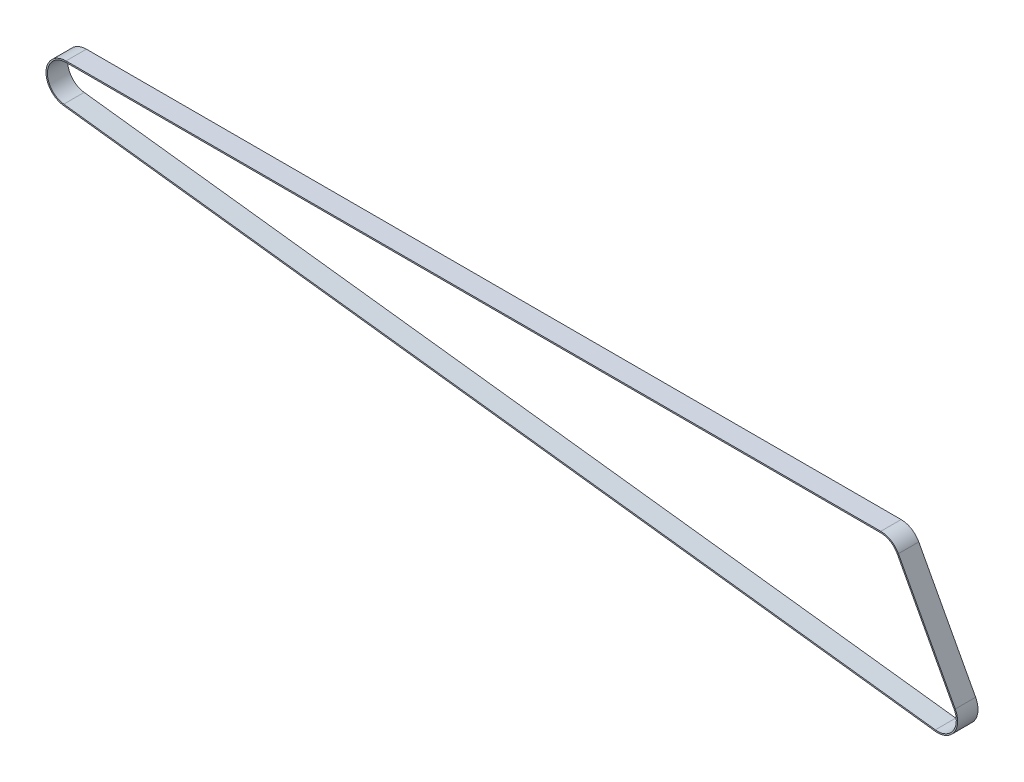
ISO-10303-21;
HEADER;
FILE_DESCRIPTION(('STEP AP214'),'2;1');
FILE_NAME('part.step','',(''),(''),'','','');
FILE_SCHEMA(('AUTOMOTIVE_DESIGN { 1 0 10303 214 1 1 1 1 }'));
ENDSEC;
DATA;
#1=APPLICATION_CONTEXT('core data for automotive mechanical design processes');
#2=APPLICATION_PROTOCOL_DEFINITION('international standard','automotive_design',2000,#1);
#3=PRODUCT_CONTEXT('',#1,'mechanical');
#4=PRODUCT('Part','Part','',(#3));
#5=PRODUCT_RELATED_PRODUCT_CATEGORY('part','',(#4));
#6=PRODUCT_DEFINITION_FORMATION('','',#4);
#7=PRODUCT_DEFINITION_CONTEXT('part definition',#1,'design');
#8=PRODUCT_DEFINITION('design','',#6,#7);
#9=PRODUCT_DEFINITION_SHAPE('','',#8);
#10=(LENGTH_UNIT() NAMED_UNIT(*) SI_UNIT(.MILLI.,.METRE.));
#11=(NAMED_UNIT(*) PLANE_ANGLE_UNIT() SI_UNIT($,.RADIAN.));
#12=(NAMED_UNIT(*) SI_UNIT($,.STERADIAN.) SOLID_ANGLE_UNIT());
#13=UNCERTAINTY_MEASURE_WITH_UNIT(LENGTH_MEASURE(1.E-05),#10,'distance_accuracy_value','');
#14=(GEOMETRIC_REPRESENTATION_CONTEXT(3) GLOBAL_UNCERTAINTY_ASSIGNED_CONTEXT((#13)) GLOBAL_UNIT_ASSIGNED_CONTEXT((#10,
#11,#12)) REPRESENTATION_CONTEXT('',''));
#15=CARTESIAN_POINT('',(0.,0.,0.));
#16=DIRECTION('',(0.,0.,1.));
#17=DIRECTION('',(1.,0.,0.));
#18=AXIS2_PLACEMENT_3D('',#15,#16,#17);
#19=CARTESIAN_POINT('',(-240.,0.,6.));
#20=DIRECTION('',(0.,0.,-1.));
#21=DIRECTION('',(-1.,0.,0.));
#22=AXIS2_PLACEMENT_3D('',#19,#20,#21);
#23=PLANE('',#22);
#24=CARTESIAN_POINT('',(-240.,0.,6.));
#25=DIRECTION('',(0.,0.,-1.));
#26=DIRECTION('',(-1.,0.,0.));
#27=AXIS2_PLACEMENT_3D('',#24,#25,#26);
#28=CIRCLE('',#27,11.8);
#29=CARTESIAN_POINT('',(-240.,11.8,6.));
#30=VERTEX_POINT('',#29);
#31=CARTESIAN_POINT('',(-241.425700500669,-11.7135553134986,6.));
#32=VERTEX_POINT('',#31);
#33=EDGE_CURVE('E209',#30,#32,#28,.F.);
#34=ORIENTED_EDGE('',*,*,#33,.T.);
#35=DIRECTION('',(0.992674179110051,-0.120822076327903,0.));
#36=VECTOR('',#35,1.);
#37=CARTESIAN_POINT('',(-241.425700500669,-11.7135553134986,6.));
#38=LINE('',#37,#36);
#39=CARTESIAN_POINT('',(272.074299499331,-74.2135553134986,6.));
#40=VERTEX_POINT('',#39);
#41=EDGE_CURVE('E212',#32,#40,#38,.T.);
#42=ORIENTED_EDGE('',*,*,#41,.T.);
#43=CARTESIAN_POINT('',(273.5,-62.5,6.));
#44=DIRECTION('',(0.,0.,-1.));
#45=DIRECTION('',(-1.,0.,0.));
#46=AXIS2_PLACEMENT_3D('',#43,#44,#45);
#47=CIRCLE('',#46,11.8);
#48=CARTESIAN_POINT('',(283.90022649496,-56.9254785987015,6.));
#49=VERTEX_POINT('',#48);
#50=EDGE_CURVE('E215',#40,#49,#47,.F.);
#51=ORIENTED_EDGE('',*,*,#50,.T.);
#52=DIRECTION('',(-0.472417067906652,0.881375126691514,0.));
#53=VECTOR('',#52,1.);
#54=CARTESIAN_POINT('',(143.274841191191,205.435314878479,6.));
#55=LINE('',#54,#53);
#56=CARTESIAN_POINT('',(250.40022649496,5.57452140129849,6.));
#57=VERTEX_POINT('',#56);
#58=EDGE_CURVE('E217',#49,#57,#55,.T.);
#59=ORIENTED_EDGE('',*,*,#58,.T.);
#60=CARTESIAN_POINT('',(240.000000000001,0.,6.));
#61=DIRECTION('',(0.,0.,-1.));
#62=DIRECTION('',(-1.,0.,0.));
#63=AXIS2_PLACEMENT_3D('',#60,#61,#62);
#64=CIRCLE('',#63,11.7999999999996);
#65=CARTESIAN_POINT('',(240.000000000001,11.7999999999996,6.));
#66=VERTEX_POINT('',#65);
#67=EDGE_CURVE('E219',#57,#66,#64,.F.);
#68=ORIENTED_EDGE('',*,*,#67,.T.);
#69=DIRECTION('',(-1.,0.,0.));
#70=VECTOR('',#69,1.);
#71=CARTESIAN_POINT('',(-240.,11.8,6.));
#72=LINE('',#71,#70);
#73=EDGE_CURVE('E221',#66,#30,#72,.T.);
#74=ORIENTED_EDGE('',*,*,#73,.T.);
#75=EDGE_LOOP('',(#34,#42,#51,#59,#68,#74));
#76=FACE_BOUND('',#75,.T.);
#77=CARTESIAN_POINT('',(-240.,0.,6.));
#78=DIRECTION('',(0.,0.,1.));
#79=DIRECTION('',(-1.,0.,0.));
#80=AXIS2_PLACEMENT_3D('',#77,#78,#79);
#81=CIRCLE('',#80,11.);
#82=CARTESIAN_POINT('',(-240.,11.,6.));
#83=VERTEX_POINT('',#82);
#84=CARTESIAN_POINT('',(-241.329042839607,-10.9194159702106,6.));
#85=VERTEX_POINT('',#84);
#86=EDGE_CURVE('E158',#83,#85,#81,.T.);
#87=ORIENTED_EDGE('',*,*,#86,.F.);
#88=DIRECTION('',(-1.,0.,0.));
#89=VECTOR('',#88,1.);
#90=CARTESIAN_POINT('',(-240.,11.,6.));
#91=LINE('',#90,#89);
#92=CARTESIAN_POINT('',(240.000000000001,11.,6.));
#93=VERTEX_POINT('',#92);
#94=EDGE_CURVE('E187',#93,#83,#91,.T.);
#95=ORIENTED_EDGE('',*,*,#94,.F.);
#96=CARTESIAN_POINT('',(240.000000000001,0.,6.));
#97=DIRECTION('',(0.,0.,1.));
#98=DIRECTION('',(-1.,0.,0.));
#99=AXIS2_PLACEMENT_3D('',#96,#97,#98);
#100=CIRCLE('',#99,10.9999999999996);
#101=CARTESIAN_POINT('',(249.695126393607,5.19658774697317,6.));
#102=VERTEX_POINT('',#101);
#103=EDGE_CURVE('E185',#102,#93,#100,.T.);
#104=ORIENTED_EDGE('',*,*,#103,.F.);
#105=DIRECTION('',(-0.472417067906652,0.881375126691514,0.));
#106=VECTOR('',#105,1.);
#107=CARTESIAN_POINT('',(249.695126393607,5.19658774697317,6.));
#108=LINE('',#107,#106);
#109=CARTESIAN_POINT('',(283.195126393607,-57.3034122530268,6.));
#110=VERTEX_POINT('',#109);
#111=EDGE_CURVE('E181',#110,#102,#108,.T.);
#112=ORIENTED_EDGE('',*,*,#111,.F.);
#113=CARTESIAN_POINT('',(273.5,-62.5,6.));
#114=DIRECTION('',(0.,0.,1.));
#115=DIRECTION('',(-1.,0.,0.));
#116=AXIS2_PLACEMENT_3D('',#113,#114,#115);
#117=CIRCLE('',#116,11.);
#118=CARTESIAN_POINT('',(272.170957160393,-73.4194159702106,6.));
#119=VERTEX_POINT('',#118);
#120=EDGE_CURVE('E179',#119,#110,#117,.T.);
#121=ORIENTED_EDGE('',*,*,#120,.F.);
#122=DIRECTION('',(0.992674179110052,-0.120822076327903,0.));
#123=VECTOR('',#122,1.);
#124=CARTESIAN_POINT('',(-241.329042839607,-10.9194159702106,6.));
#125=LINE('',#124,#123);
#126=EDGE_CURVE('E166',#85,#119,#125,.T.);
#127=ORIENTED_EDGE('',*,*,#126,.F.);
#128=EDGE_LOOP('',(#87,#95,#104,#112,#121,#127));
#129=FACE_BOUND('',#128,.T.);
#130=ADVANCED_FACE('F69',(#76,#129),#23,.F.);
#131=CARTESIAN_POINT('',(-240.,0.,-6.));
#132=DIRECTION('',(0.,0.,-1.));
#133=DIRECTION('',(-1.,0.,0.));
#134=AXIS2_PLACEMENT_3D('',#131,#132,#133);
#135=PLANE('',#134);
#136=CARTESIAN_POINT('',(-240.,0.,-6.));
#137=DIRECTION('',(0.,0.,-1.));
#138=DIRECTION('',(-1.,0.,0.));
#139=AXIS2_PLACEMENT_3D('',#136,#137,#138);
#140=CIRCLE('',#139,11.8);
#141=CARTESIAN_POINT('',(-240.,11.8,-6.));
#142=VERTEX_POINT('',#141);
#143=CARTESIAN_POINT('',(-241.425700500669,-11.7135553134986,-6.));
#144=VERTEX_POINT('',#143);
#145=EDGE_CURVE('E174',#142,#144,#140,.F.);
#146=ORIENTED_EDGE('',*,*,#145,.F.);
#147=DIRECTION('',(-1.,0.,0.));
#148=VECTOR('',#147,1.);
#149=CARTESIAN_POINT('',(-240.,11.8,-6.));
#150=LINE('',#149,#148);
#151=CARTESIAN_POINT('',(240.000000000001,11.7999999999996,-6.));
#152=VERTEX_POINT('',#151);
#153=EDGE_CURVE('E213',#152,#142,#150,.T.);
#154=ORIENTED_EDGE('',*,*,#153,.F.);
#155=CARTESIAN_POINT('',(240.000000000001,0.,-6.));
#156=DIRECTION('',(0.,0.,-1.));
#157=DIRECTION('',(-1.,0.,0.));
#158=AXIS2_PLACEMENT_3D('',#155,#156,#157);
#159=CIRCLE('',#158,11.7999999999996);
#160=CARTESIAN_POINT('',(250.40022649496,5.57452140129849,-6.));
#161=VERTEX_POINT('',#160);
#162=EDGE_CURVE('E232',#161,#152,#159,.F.);
#163=ORIENTED_EDGE('',*,*,#162,.F.);
#164=DIRECTION('',(-0.472417067906652,0.881375126691514,0.));
#165=VECTOR('',#164,1.);
#166=CARTESIAN_POINT('',(143.274841191191,205.435314878479,-6.));
#167=LINE('',#166,#165);
#168=CARTESIAN_POINT('',(283.90022649496,-56.9254785987015,-6.));
#169=VERTEX_POINT('',#168);
#170=EDGE_CURVE('E230',#169,#161,#167,.T.);
#171=ORIENTED_EDGE('',*,*,#170,.F.);
#172=CARTESIAN_POINT('',(273.5,-62.5,-6.));
#173=DIRECTION('',(0.,0.,-1.));
#174=DIRECTION('',(-1.,0.,0.));
#175=AXIS2_PLACEMENT_3D('',#172,#173,#174);
#176=CIRCLE('',#175,11.8);
#177=CARTESIAN_POINT('',(272.074299499331,-74.2135553134986,-6.));
#178=VERTEX_POINT('',#177);
#179=EDGE_CURVE('E228',#178,#169,#176,.F.);
#180=ORIENTED_EDGE('',*,*,#179,.F.);
#181=DIRECTION('',(0.992674179110051,-0.120822076327903,0.));
#182=VECTOR('',#181,1.);
#183=CARTESIAN_POINT('',(-241.425700500669,-11.7135553134986,-6.));
#184=LINE('',#183,#182);
#185=EDGE_CURVE('E226',#144,#178,#184,.T.);
#186=ORIENTED_EDGE('',*,*,#185,.F.);
#187=EDGE_LOOP('',(#146,#154,#163,#171,#180,#186));
#188=FACE_BOUND('',#187,.T.);
#189=DIRECTION('',(-1.,0.,0.));
#190=VECTOR('',#189,1.);
#191=CARTESIAN_POINT('',(-240.,11.,-6.));
#192=LINE('',#191,#190);
#193=CARTESIAN_POINT('',(240.000000000001,10.9999999999996,-6.));
#194=VERTEX_POINT('',#193);
#195=CARTESIAN_POINT('',(-240.,11.,-6.));
#196=VERTEX_POINT('',#195);
#197=EDGE_CURVE('E167',#194,#196,#192,.T.);
#198=ORIENTED_EDGE('',*,*,#197,.T.);
#199=CARTESIAN_POINT('',(-240.,0.,-6.));
#200=DIRECTION('',(0.,0.,1.));
#201=DIRECTION('',(-1.,0.,0.));
#202=AXIS2_PLACEMENT_3D('',#199,#200,#201);
#203=CIRCLE('',#202,11.);
#204=CARTESIAN_POINT('',(-241.329042839607,-10.9194159702106,-6.));
#205=VERTEX_POINT('',#204);
#206=EDGE_CURVE('E92',#196,#205,#203,.T.);
#207=ORIENTED_EDGE('',*,*,#206,.T.);
#208=DIRECTION('',(0.992674179110052,-0.120822076327903,0.));
#209=VECTOR('',#208,1.);
#210=CARTESIAN_POINT('',(-241.329042839607,-10.9194159702106,-6.));
#211=LINE('',#210,#209);
#212=CARTESIAN_POINT('',(272.170957160393,-73.4194159702106,-6.));
#213=VERTEX_POINT('',#212);
#214=EDGE_CURVE('E173',#205,#213,#211,.T.);
#215=ORIENTED_EDGE('',*,*,#214,.T.);
#216=CARTESIAN_POINT('',(273.5,-62.5,-6.));
#217=DIRECTION('',(0.,0.,1.));
#218=DIRECTION('',(-1.,0.,0.));
#219=AXIS2_PLACEMENT_3D('',#216,#217,#218);
#220=CIRCLE('',#219,11.);
#221=CARTESIAN_POINT('',(283.195126393607,-57.3034122530268,-6.));
#222=VERTEX_POINT('',#221);
#223=EDGE_CURVE('E191',#213,#222,#220,.T.);
#224=ORIENTED_EDGE('',*,*,#223,.T.);
#225=DIRECTION('',(-0.472417067906652,0.881375126691514,0.));
#226=VECTOR('',#225,1.);
#227=CARTESIAN_POINT('',(249.695126393607,5.19658774697317,-6.));
#228=LINE('',#227,#226);
#229=CARTESIAN_POINT('',(249.695126393607,5.19658774697317,-6.));
#230=VERTEX_POINT('',#229);
#231=EDGE_CURVE('E194',#222,#230,#228,.T.);
#232=ORIENTED_EDGE('',*,*,#231,.T.);
#233=CARTESIAN_POINT('',(240.000000000001,0.,-6.));
#234=DIRECTION('',(0.,0.,1.));
#235=DIRECTION('',(-1.,0.,0.));
#236=AXIS2_PLACEMENT_3D('',#233,#234,#235);
#237=CIRCLE('',#236,10.9999999999996);
#238=EDGE_CURVE('E197',#230,#194,#237,.T.);
#239=ORIENTED_EDGE('',*,*,#238,.T.);
#240=EDGE_LOOP('',(#198,#207,#215,#224,#232,#239));
#241=FACE_BOUND('',#240,.T.);
#242=ADVANCED_FACE('F256',(#188,#241),#135,.T.);
#243=CARTESIAN_POINT('',(-240.,0.,6.));
#244=DIRECTION('',(0.,0.,-1.));
#245=DIRECTION('',(-1.,0.,0.));
#246=AXIS2_PLACEMENT_3D('',#243,#244,#245);
#247=CYLINDRICAL_SURFACE('',#246,11.8);
#248=ORIENTED_EDGE('',*,*,#145,.T.);
#249=DIRECTION('',(0.,0.,-1.));
#250=VECTOR('',#249,1.);
#251=CARTESIAN_POINT('',(-241.425700500669,-11.7135553134986,6.));
#252=LINE('',#251,#250);
#253=EDGE_CURVE('E12',#32,#144,#252,.T.);
#254=ORIENTED_EDGE('',*,*,#253,.F.);
#255=ORIENTED_EDGE('',*,*,#33,.F.);
#256=DIRECTION('',(0.,0.,-1.));
#257=VECTOR('',#256,1.);
#258=CARTESIAN_POINT('',(-240.,11.8,6.));
#259=LINE('',#258,#257);
#260=EDGE_CURVE('E223',#30,#142,#259,.T.);
#261=ORIENTED_EDGE('',*,*,#260,.T.);
#262=EDGE_LOOP('',(#248,#254,#255,#261));
#263=FACE_BOUND('',#262,.T.);
#264=ADVANCED_FACE('F71',(#263),#247,.T.);
#265=CARTESIAN_POINT('',(-241.425700500669,-11.7135553134986,6.));
#266=DIRECTION('',(0.120822076327903,0.992674179110051,0.));
#267=DIRECTION('',(-0.992674179110052,0.120822076327903,0.));
#268=AXIS2_PLACEMENT_3D('',#265,#266,#267);
#269=PLANE('',#268);
#270=ORIENTED_EDGE('',*,*,#185,.T.);
#271=DIRECTION('',(0.,0.,-1.));
#272=VECTOR('',#271,1.);
#273=CARTESIAN_POINT('',(272.074299499331,-74.2135553134986,6.));
#274=LINE('',#273,#272);
#275=EDGE_CURVE('E77',#40,#178,#274,.T.);
#276=ORIENTED_EDGE('',*,*,#275,.F.);
#277=ORIENTED_EDGE('',*,*,#41,.F.);
#278=ORIENTED_EDGE('',*,*,#253,.T.);
#279=EDGE_LOOP('',(#270,#276,#277,#278));
#280=FACE_BOUND('',#279,.T.);
#281=ADVANCED_FACE('F273',(#280),#269,.F.);
#282=CARTESIAN_POINT('',(273.5,-62.5,6.));
#283=DIRECTION('',(0.,0.,-1.));
#284=DIRECTION('',(-1.,0.,0.));
#285=AXIS2_PLACEMENT_3D('',#282,#283,#284);
#286=CYLINDRICAL_SURFACE('',#285,11.8);
#287=ORIENTED_EDGE('',*,*,#179,.T.);
#288=DIRECTION('',(0.,0.,-1.));
#289=VECTOR('',#288,1.);
#290=CARTESIAN_POINT('',(283.90022649496,-56.9254785987015,6.));
#291=LINE('',#290,#289);
#292=EDGE_CURVE('E243',#49,#169,#291,.T.);
#293=ORIENTED_EDGE('',*,*,#292,.F.);
#294=ORIENTED_EDGE('',*,*,#50,.F.);
#295=ORIENTED_EDGE('',*,*,#275,.T.);
#296=EDGE_LOOP('',(#287,#293,#294,#295));
#297=FACE_BOUND('',#296,.T.);
#298=ADVANCED_FACE('F250',(#297),#286,.T.);
#299=CARTESIAN_POINT('',(143.274841191191,205.435314878479,6.));
#300=DIRECTION('',(-0.881375126691514,-0.472417067906652,0.));
#301=DIRECTION('',(0.472417067906652,-0.881375126691514,0.));
#302=AXIS2_PLACEMENT_3D('',#299,#300,#301);
#303=PLANE('',#302);
#304=ORIENTED_EDGE('',*,*,#170,.T.);
#305=DIRECTION('',(0.,0.,-1.));
#306=VECTOR('',#305,1.);
#307=CARTESIAN_POINT('',(250.40022649496,5.57452140129849,6.));
#308=LINE('',#307,#306);
#309=EDGE_CURVE('E240',#57,#161,#308,.T.);
#310=ORIENTED_EDGE('',*,*,#309,.F.);
#311=ORIENTED_EDGE('',*,*,#58,.F.);
#312=ORIENTED_EDGE('',*,*,#292,.T.);
#313=EDGE_LOOP('',(#304,#310,#311,#312));
#314=FACE_BOUND('',#313,.T.);
#315=ADVANCED_FACE('F262',(#314),#303,.F.);
#316=CARTESIAN_POINT('',(240.000000000001,0.,6.));
#317=DIRECTION('',(0.,0.,-1.));
#318=DIRECTION('',(-1.,0.,0.));
#319=AXIS2_PLACEMENT_3D('',#316,#317,#318);
#320=CYLINDRICAL_SURFACE('',#319,11.7999999999996);
#321=ORIENTED_EDGE('',*,*,#162,.T.);
#322=DIRECTION('',(0.,0.,-1.));
#323=VECTOR('',#322,1.);
#324=CARTESIAN_POINT('',(240.000000000001,11.7999999999996,6.));
#325=LINE('',#324,#323);
#326=EDGE_CURVE('E237',#66,#152,#325,.T.);
#327=ORIENTED_EDGE('',*,*,#326,.F.);
#328=ORIENTED_EDGE('',*,*,#67,.F.);
#329=ORIENTED_EDGE('',*,*,#309,.T.);
#330=EDGE_LOOP('',(#321,#327,#328,#329));
#331=FACE_BOUND('',#330,.T.);
#332=ADVANCED_FACE('F266',(#331),#320,.T.);
#333=CARTESIAN_POINT('',(-240.,11.8,6.));
#334=DIRECTION('',(0.,-1.,0.));
#335=DIRECTION('',(0.,0.,-1.));
#336=AXIS2_PLACEMENT_3D('',#333,#334,#335);
#337=PLANE('',#336);
#338=ORIENTED_EDGE('',*,*,#153,.T.);
#339=ORIENTED_EDGE('',*,*,#260,.F.);
#340=ORIENTED_EDGE('',*,*,#73,.F.);
#341=ORIENTED_EDGE('',*,*,#326,.T.);
#342=EDGE_LOOP('',(#338,#339,#340,#341));
#343=FACE_BOUND('',#342,.T.);
#344=ADVANCED_FACE('F276',(#343),#337,.F.);
#345=CARTESIAN_POINT('',(-240.,0.,6.));
#346=DIRECTION('',(0.,0.,-1.));
#347=DIRECTION('',(-1.,0.,0.));
#348=AXIS2_PLACEMENT_3D('',#345,#346,#347);
#349=CYLINDRICAL_SURFACE('',#348,11.);
#350=ORIENTED_EDGE('',*,*,#206,.F.);
#351=DIRECTION('',(0.,0.,-1.));
#352=VECTOR('',#351,1.);
#353=CARTESIAN_POINT('',(-240.,11.,6.));
#354=LINE('',#353,#352);
#355=EDGE_CURVE('E162',#83,#196,#354,.T.);
#356=ORIENTED_EDGE('',*,*,#355,.F.);
#357=ORIENTED_EDGE('',*,*,#86,.T.);
#358=DIRECTION('',(0.,0.,-1.));
#359=VECTOR('',#358,1.);
#360=CARTESIAN_POINT('',(-241.329042839607,-10.9194159702106,6.));
#361=LINE('',#360,#359);
#362=EDGE_CURVE('E161',#85,#205,#361,.T.);
#363=ORIENTED_EDGE('',*,*,#362,.T.);
#364=EDGE_LOOP('',(#350,#356,#357,#363));
#365=FACE_BOUND('',#364,.T.);
#366=ADVANCED_FACE('F160',(#365),#349,.F.);
#367=CARTESIAN_POINT('',(-241.329042839607,-10.9194159702106,6.));
#368=DIRECTION('',(0.120822076327903,0.992674179110051,0.));
#369=DIRECTION('',(-0.992674179110052,0.120822076327903,0.));
#370=AXIS2_PLACEMENT_3D('',#367,#368,#369);
#371=PLANE('',#370);
#372=ORIENTED_EDGE('',*,*,#214,.F.);
#373=ORIENTED_EDGE('',*,*,#362,.F.);
#374=ORIENTED_EDGE('',*,*,#126,.T.);
#375=DIRECTION('',(0.,0.,-1.));
#376=VECTOR('',#375,1.);
#377=CARTESIAN_POINT('',(272.170957160393,-73.4194159702106,6.));
#378=LINE('',#377,#376);
#379=EDGE_CURVE('E175',#119,#213,#378,.T.);
#380=ORIENTED_EDGE('',*,*,#379,.T.);
#381=EDGE_LOOP('',(#372,#373,#374,#380));
#382=FACE_BOUND('',#381,.T.);
#383=ADVANCED_FACE('F170',(#382),#371,.T.);
#384=CARTESIAN_POINT('',(273.5,-62.5,6.));
#385=DIRECTION('',(0.,0.,-1.));
#386=DIRECTION('',(-1.,0.,0.));
#387=AXIS2_PLACEMENT_3D('',#384,#385,#386);
#388=CYLINDRICAL_SURFACE('',#387,11.);
#389=ORIENTED_EDGE('',*,*,#223,.F.);
#390=ORIENTED_EDGE('',*,*,#379,.F.);
#391=ORIENTED_EDGE('',*,*,#120,.T.);
#392=DIRECTION('',(0.,0.,-1.));
#393=VECTOR('',#392,1.);
#394=CARTESIAN_POINT('',(283.195126393607,-57.3034122530268,6.));
#395=LINE('',#394,#393);
#396=EDGE_CURVE('E206',#110,#222,#395,.T.);
#397=ORIENTED_EDGE('',*,*,#396,.T.);
#398=EDGE_LOOP('',(#389,#390,#391,#397));
#399=FACE_BOUND('',#398,.T.);
#400=ADVANCED_FACE('F294',(#399),#388,.F.);
#401=CARTESIAN_POINT('',(249.695126393607,5.19658774697317,6.));
#402=DIRECTION('',(-0.881375126691514,-0.472417067906652,0.));
#403=DIRECTION('',(0.472417067906652,-0.881375126691514,0.));
#404=AXIS2_PLACEMENT_3D('',#401,#402,#403);
#405=PLANE('',#404);
#406=ORIENTED_EDGE('',*,*,#231,.F.);
#407=ORIENTED_EDGE('',*,*,#396,.F.);
#408=ORIENTED_EDGE('',*,*,#111,.T.);
#409=DIRECTION('',(0.,0.,-1.));
#410=VECTOR('',#409,1.);
#411=CARTESIAN_POINT('',(249.695126393607,5.19658774697317,6.));
#412=LINE('',#411,#410);
#413=EDGE_CURVE('E204',#102,#230,#412,.T.);
#414=ORIENTED_EDGE('',*,*,#413,.T.);
#415=EDGE_LOOP('',(#406,#407,#408,#414));
#416=FACE_BOUND('',#415,.T.);
#417=ADVANCED_FACE('F297',(#416),#405,.T.);
#418=CARTESIAN_POINT('',(240.000000000001,0.,6.));
#419=DIRECTION('',(0.,0.,-1.));
#420=DIRECTION('',(-1.,0.,0.));
#421=AXIS2_PLACEMENT_3D('',#418,#419,#420);
#422=CYLINDRICAL_SURFACE('',#421,10.9999999999996);
#423=ORIENTED_EDGE('',*,*,#238,.F.);
#424=ORIENTED_EDGE('',*,*,#413,.F.);
#425=ORIENTED_EDGE('',*,*,#103,.T.);
#426=DIRECTION('',(0.,0.,-1.));
#427=VECTOR('',#426,1.);
#428=CARTESIAN_POINT('',(240.000000000001,10.9999999999996,6.));
#429=LINE('',#428,#427);
#430=EDGE_CURVE('E84',#93,#194,#429,.T.);
#431=ORIENTED_EDGE('',*,*,#430,.T.);
#432=EDGE_LOOP('',(#423,#424,#425,#431));
#433=FACE_BOUND('',#432,.T.);
#434=ADVANCED_FACE('F301',(#433),#422,.F.);
#435=CARTESIAN_POINT('',(-240.,11.,6.));
#436=DIRECTION('',(0.,-1.,0.));
#437=DIRECTION('',(0.,0.,-1.));
#438=AXIS2_PLACEMENT_3D('',#435,#436,#437);
#439=PLANE('',#438);
#440=ORIENTED_EDGE('',*,*,#197,.F.);
#441=ORIENTED_EDGE('',*,*,#430,.F.);
#442=ORIENTED_EDGE('',*,*,#94,.T.);
#443=ORIENTED_EDGE('',*,*,#355,.T.);
#444=EDGE_LOOP('',(#440,#441,#442,#443));
#445=FACE_BOUND('',#444,.T.);
#446=ADVANCED_FACE('F305',(#445),#439,.T.);
#447=CLOSED_SHELL('',(#130,#242,#264,#281,#298,#315,#332,#344,#366,#383,#400,#417,#434,#446));
#448=MANIFOLD_SOLID_BREP('B2',#447);
#449=ADVANCED_BREP_SHAPE_REPRESENTATION('',(#18,#448),#14);
#450=SHAPE_DEFINITION_REPRESENTATION(#9,#449);
ENDSEC;
END-ISO-10303-21;
